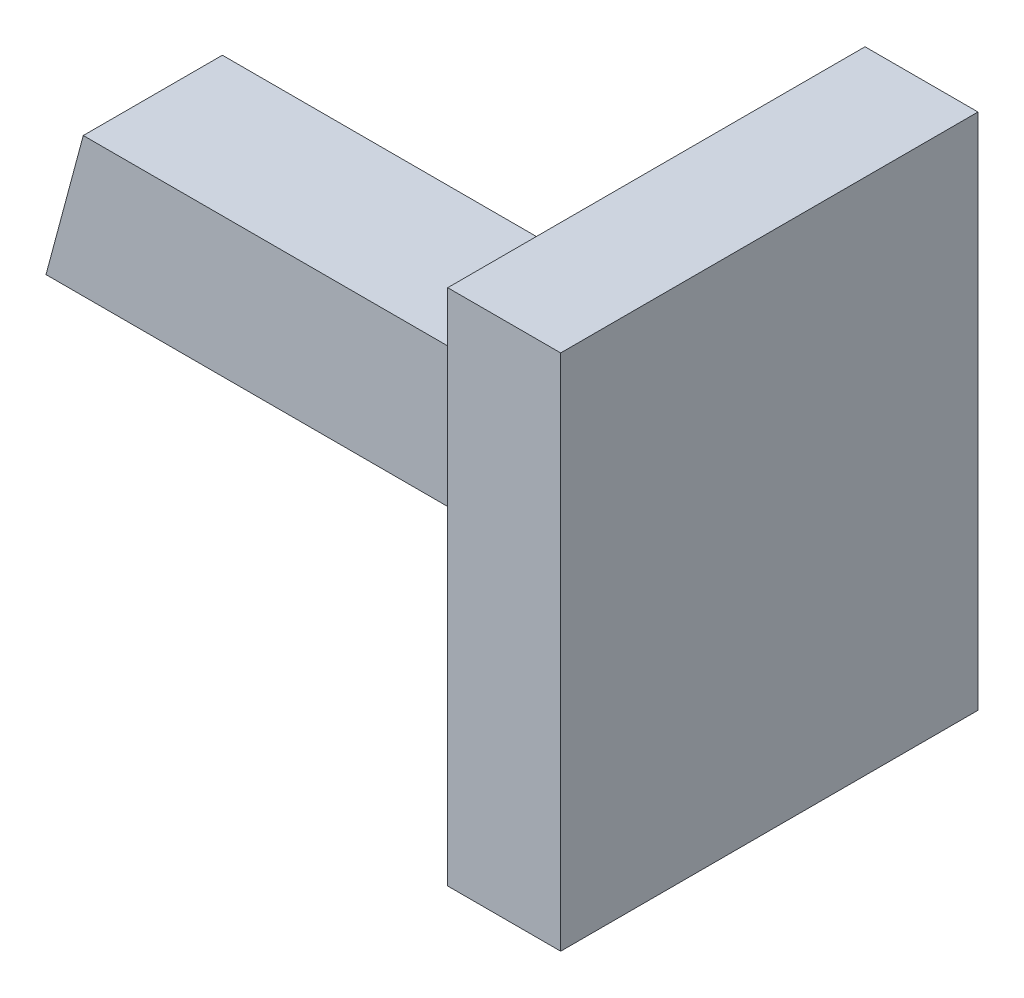
ISO-10303-21;
HEADER;
FILE_DESCRIPTION(('STEP AP214'),'2;1');
FILE_NAME('part.step','',(''),(''),'','','');
FILE_SCHEMA(('AUTOMOTIVE_DESIGN { 1 0 10303 214 1 1 1 1 }'));
ENDSEC;
DATA;
#1=APPLICATION_CONTEXT('core data for automotive mechanical design processes');
#2=APPLICATION_PROTOCOL_DEFINITION('international standard','automotive_design',2000,#1);
#3=PRODUCT_CONTEXT('',#1,'mechanical');
#4=PRODUCT('Part','Part','',(#3));
#5=PRODUCT_RELATED_PRODUCT_CATEGORY('part','',(#4));
#6=PRODUCT_DEFINITION_FORMATION('','',#4);
#7=PRODUCT_DEFINITION_CONTEXT('part definition',#1,'design');
#8=PRODUCT_DEFINITION('design','',#6,#7);
#9=PRODUCT_DEFINITION_SHAPE('','',#8);
#10=(LENGTH_UNIT() NAMED_UNIT(*) SI_UNIT(.MILLI.,.METRE.));
#11=(NAMED_UNIT(*) PLANE_ANGLE_UNIT() SI_UNIT($,.RADIAN.));
#12=(NAMED_UNIT(*) SI_UNIT($,.STERADIAN.) SOLID_ANGLE_UNIT());
#13=UNCERTAINTY_MEASURE_WITH_UNIT(LENGTH_MEASURE(1.E-05),#10,'distance_accuracy_value','');
#14=(GEOMETRIC_REPRESENTATION_CONTEXT(3) GLOBAL_UNCERTAINTY_ASSIGNED_CONTEXT((#13)) GLOBAL_UNIT_ASSIGNED_CONTEXT((#10,
#11,#12)) REPRESENTATION_CONTEXT('',''));
#15=CARTESIAN_POINT('',(0.,0.,0.));
#16=DIRECTION('',(0.,0.,1.));
#17=DIRECTION('',(1.,0.,0.));
#18=AXIS2_PLACEMENT_3D('',#15,#16,#17);
#19=CARTESIAN_POINT('',(0.,0.,10.));
#20=DIRECTION('',(0.,1.,0.));
#21=DIRECTION('',(0.,0.,1.));
#22=AXIS2_PLACEMENT_3D('',#19,#20,#21);
#23=PLANE('',#22);
#24=DIRECTION('',(1.,0.,0.));
#25=VECTOR('',#24,1.);
#26=CARTESIAN_POINT('',(0.,0.,0.));
#27=LINE('',#26,#25);
#28=CARTESIAN_POINT('',(0.,0.,0.));
#29=VERTEX_POINT('',#28);
#30=CARTESIAN_POINT('',(38.8790967226219,0.,0.));
#31=VERTEX_POINT('',#30);
#32=EDGE_CURVE('E133',#29,#31,#27,.T.);
#33=ORIENTED_EDGE('',*,*,#32,.T.);
#34=DIRECTION('',(0.,0.,1.));
#35=VECTOR('',#34,1.);
#36=CARTESIAN_POINT('',(38.8790967226219,0.,10.));
#37=LINE('',#36,#35);
#38=CARTESIAN_POINT('',(38.8790967226219,0.,10.));
#39=VERTEX_POINT('',#38);
#40=EDGE_CURVE('E125',#31,#39,#37,.T.);
#41=ORIENTED_EDGE('',*,*,#40,.T.);
#42=DIRECTION('',(1.,0.,0.));
#43=VECTOR('',#42,1.);
#44=CARTESIAN_POINT('',(0.,0.,10.));
#45=LINE('',#44,#43);
#46=CARTESIAN_POINT('',(0.,0.,10.));
#47=VERTEX_POINT('',#46);
#48=EDGE_CURVE('E121',#47,#39,#45,.T.);
#49=ORIENTED_EDGE('',*,*,#48,.F.);
#50=DIRECTION('',(0.,0.,-1.));
#51=VECTOR('',#50,1.);
#52=CARTESIAN_POINT('',(0.,0.,10.));
#53=LINE('',#52,#51);
#54=EDGE_CURVE('E109',#47,#29,#53,.T.);
#55=ORIENTED_EDGE('',*,*,#54,.T.);
#56=EDGE_LOOP('',(#33,#41,#49,#55));
#57=FACE_BOUND('',#56,.T.);
#58=ADVANCED_FACE('F45',(#57),#23,.F.);
#59=CARTESIAN_POINT('',(0.,10.,10.));
#60=DIRECTION('',(0.,-1.,0.));
#61=DIRECTION('',(0.,0.,-1.));
#62=AXIS2_PLACEMENT_3D('',#59,#60,#61);
#63=PLANE('',#62);
#64=DIRECTION('',(-1.,0.,0.));
#65=VECTOR('',#64,1.);
#66=CARTESIAN_POINT('',(0.,10.,0.));
#67=LINE('',#66,#65);
#68=CARTESIAN_POINT('',(38.8790967226219,10.,0.));
#69=VERTEX_POINT('',#68);
#70=CARTESIAN_POINT('',(2.67949192431127,10.,0.));
#71=VERTEX_POINT('',#70);
#72=EDGE_CURVE('E127',#69,#71,#67,.T.);
#73=ORIENTED_EDGE('',*,*,#72,.T.);
#74=DIRECTION('',(0.,0.,1.));
#75=VECTOR('',#74,1.);
#76=CARTESIAN_POINT('',(2.67949192431127,10.,-10.));
#77=LINE('',#76,#75);
#78=CARTESIAN_POINT('',(2.67949192431127,10.,10.));
#79=VERTEX_POINT('',#78);
#80=EDGE_CURVE('E59',#71,#79,#77,.T.);
#81=ORIENTED_EDGE('',*,*,#80,.T.);
#82=DIRECTION('',(-1.,0.,0.));
#83=VECTOR('',#82,1.);
#84=CARTESIAN_POINT('',(0.,10.,10.));
#85=LINE('',#84,#83);
#86=CARTESIAN_POINT('',(38.8790967226219,10.,10.));
#87=VERTEX_POINT('',#86);
#88=EDGE_CURVE('E118',#87,#79,#85,.T.);
#89=ORIENTED_EDGE('',*,*,#88,.F.);
#90=DIRECTION('',(0.,0.,-1.));
#91=VECTOR('',#90,1.);
#92=CARTESIAN_POINT('',(38.8790967226219,10.,10.));
#93=LINE('',#92,#91);
#94=EDGE_CURVE('E145',#87,#69,#93,.T.);
#95=ORIENTED_EDGE('',*,*,#94,.T.);
#96=EDGE_LOOP('',(#73,#81,#89,#95));
#97=FACE_BOUND('',#96,.T.);
#98=ADVANCED_FACE('F149',(#97),#63,.F.);
#99=CARTESIAN_POINT('',(0.,0.,10.));
#100=DIRECTION('',(0.,0.,-1.));
#101=DIRECTION('',(-1.,0.,0.));
#102=AXIS2_PLACEMENT_3D('',#99,#100,#101);
#103=PLANE('',#102);
#104=ORIENTED_EDGE('',*,*,#88,.T.);
#105=DIRECTION('',(0.258819045102525,0.965925826289067,0.));
#106=VECTOR('',#105,1.);
#107=CARTESIAN_POINT('',(2.67949192431127,10.,10.));
#108=LINE('',#107,#106);
#109=EDGE_CURVE('E112',#47,#79,#108,.T.);
#110=ORIENTED_EDGE('',*,*,#109,.F.);
#111=ORIENTED_EDGE('',*,*,#48,.T.);
#112=DIRECTION('',(0.,1.,0.));
#113=VECTOR('',#112,1.);
#114=CARTESIAN_POINT('',(38.8790967226219,0.,10.));
#115=LINE('',#114,#113);
#116=EDGE_CURVE('E67',#39,#87,#115,.T.);
#117=ORIENTED_EDGE('',*,*,#116,.T.);
#118=EDGE_LOOP('',(#104,#110,#111,#117));
#119=FACE_BOUND('',#118,.T.);
#120=ADVANCED_FACE('F120',(#119),#103,.F.);
#121=CARTESIAN_POINT('',(0.,0.,0.));
#122=DIRECTION('',(0.,0.,-1.));
#123=DIRECTION('',(-1.,0.,0.));
#124=AXIS2_PLACEMENT_3D('',#121,#122,#123);
#125=PLANE('',#124);
#126=DIRECTION('',(-0.258819045102525,-0.965925826289067,0.));
#127=VECTOR('',#126,1.);
#128=CARTESIAN_POINT('',(0.,0.,0.));
#129=LINE('',#128,#127);
#130=EDGE_CURVE('E11',#71,#29,#129,.T.);
#131=ORIENTED_EDGE('',*,*,#130,.F.);
#132=ORIENTED_EDGE('',*,*,#72,.F.);
#133=DIRECTION('',(0.,1.,0.));
#134=VECTOR('',#133,1.);
#135=CARTESIAN_POINT('',(38.8790967226219,0.,0.));
#136=LINE('',#135,#134);
#137=EDGE_CURVE('E53',#31,#69,#136,.T.);
#138=ORIENTED_EDGE('',*,*,#137,.F.);
#139=ORIENTED_EDGE('',*,*,#32,.F.);
#140=EDGE_LOOP('',(#131,#132,#138,#139));
#141=FACE_BOUND('',#140,.T.);
#142=ADVANCED_FACE('F147',(#141),#125,.T.);
#143=CARTESIAN_POINT('',(38.8790967226219,-13.625,-10.));
#144=DIRECTION('',(-1.,0.,0.));
#145=DIRECTION('',(0.,-1.,0.));
#146=AXIS2_PLACEMENT_3D('',#143,#144,#145);
#147=PLANE('',#146);
#148=DIRECTION('',(0.,0.,1.));
#149=VECTOR('',#148,1.);
#150=CARTESIAN_POINT('',(38.8790967226219,-13.625,-10.));
#151=LINE('',#150,#149);
#152=CARTESIAN_POINT('',(38.8790967226219,-13.625,-10.));
#153=VERTEX_POINT('',#152);
#154=CARTESIAN_POINT('',(38.8790967226219,-13.625,20.));
#155=VERTEX_POINT('',#154);
#156=EDGE_CURVE('E155',#153,#155,#151,.T.);
#157=ORIENTED_EDGE('',*,*,#156,.T.);
#158=DIRECTION('',(0.,-1.,0.));
#159=VECTOR('',#158,1.);
#160=CARTESIAN_POINT('',(38.8790967226219,-13.625,20.));
#161=LINE('',#160,#159);
#162=CARTESIAN_POINT('',(38.8790967226219,23.625,20.));
#163=VERTEX_POINT('',#162);
#164=EDGE_CURVE('E186',#163,#155,#161,.T.);
#165=ORIENTED_EDGE('',*,*,#164,.F.);
#166=DIRECTION('',(0.,0.,1.));
#167=VECTOR('',#166,1.);
#168=CARTESIAN_POINT('',(38.8790967226219,23.625,-10.));
#169=LINE('',#168,#167);
#170=CARTESIAN_POINT('',(38.8790967226219,23.625,-10.));
#171=VERTEX_POINT('',#170);
#172=EDGE_CURVE('E161',#171,#163,#169,.T.);
#173=ORIENTED_EDGE('',*,*,#172,.F.);
#174=DIRECTION('',(0.,-1.,0.));
#175=VECTOR('',#174,1.);
#176=CARTESIAN_POINT('',(38.8790967226219,-13.625,-10.));
#177=LINE('',#176,#175);
#178=EDGE_CURVE('E170',#171,#153,#177,.T.);
#179=ORIENTED_EDGE('',*,*,#178,.T.);
#180=EDGE_LOOP('',(#157,#165,#173,#179));
#181=FACE_BOUND('',#180,.T.);
#182=ORIENTED_EDGE('',*,*,#116,.F.);
#183=ORIENTED_EDGE('',*,*,#40,.F.);
#184=ORIENTED_EDGE('',*,*,#137,.T.);
#185=ORIENTED_EDGE('',*,*,#94,.F.);
#186=EDGE_LOOP('',(#182,#183,#184,#185));
#187=FACE_BOUND('',#186,.T.);
#188=ADVANCED_FACE('F143',(#181,#187),#147,.T.);
#189=CARTESIAN_POINT('',(47.,-13.625,-10.));
#190=DIRECTION('',(0.,-1.,0.));
#191=DIRECTION('',(0.,0.,-1.));
#192=AXIS2_PLACEMENT_3D('',#189,#190,#191);
#193=PLANE('',#192);
#194=DIRECTION('',(0.,0.,1.));
#195=VECTOR('',#194,1.);
#196=CARTESIAN_POINT('',(47.,-13.625,-10.));
#197=LINE('',#196,#195);
#198=CARTESIAN_POINT('',(47.,-13.625,-10.));
#199=VERTEX_POINT('',#198);
#200=CARTESIAN_POINT('',(47.,-13.625,20.));
#201=VERTEX_POINT('',#200);
#202=EDGE_CURVE('E151',#199,#201,#197,.T.);
#203=ORIENTED_EDGE('',*,*,#202,.T.);
#204=DIRECTION('',(1.,0.,0.));
#205=VECTOR('',#204,1.);
#206=CARTESIAN_POINT('',(47.,-13.625,20.));
#207=LINE('',#206,#205);
#208=EDGE_CURVE('E182',#155,#201,#207,.T.);
#209=ORIENTED_EDGE('',*,*,#208,.F.);
#210=ORIENTED_EDGE('',*,*,#156,.F.);
#211=DIRECTION('',(1.,0.,0.));
#212=VECTOR('',#211,1.);
#213=CARTESIAN_POINT('',(47.,-13.625,-10.));
#214=LINE('',#213,#212);
#215=EDGE_CURVE('E162',#153,#199,#214,.T.);
#216=ORIENTED_EDGE('',*,*,#215,.T.);
#217=EDGE_LOOP('',(#203,#209,#210,#216));
#218=FACE_BOUND('',#217,.T.);
#219=ADVANCED_FACE('F217',(#218),#193,.T.);
#220=CARTESIAN_POINT('',(47.,23.625,-10.));
#221=DIRECTION('',(0.,1.,0.));
#222=DIRECTION('',(0.,0.,1.));
#223=AXIS2_PLACEMENT_3D('',#220,#221,#222);
#224=PLANE('',#223);
#225=ORIENTED_EDGE('',*,*,#172,.T.);
#226=DIRECTION('',(-1.,0.,0.));
#227=VECTOR('',#226,1.);
#228=CARTESIAN_POINT('',(47.,23.625,20.));
#229=LINE('',#228,#227);
#230=CARTESIAN_POINT('',(47.,23.625,20.));
#231=VERTEX_POINT('',#230);
#232=EDGE_CURVE('E190',#231,#163,#229,.T.);
#233=ORIENTED_EDGE('',*,*,#232,.F.);
#234=DIRECTION('',(0.,0.,1.));
#235=VECTOR('',#234,1.);
#236=CARTESIAN_POINT('',(47.,23.625,-10.));
#237=LINE('',#236,#235);
#238=CARTESIAN_POINT('',(47.,23.625,-10.));
#239=VERTEX_POINT('',#238);
#240=EDGE_CURVE('E158',#239,#231,#237,.T.);
#241=ORIENTED_EDGE('',*,*,#240,.F.);
#242=DIRECTION('',(-1.,0.,0.));
#243=VECTOR('',#242,1.);
#244=CARTESIAN_POINT('',(47.,23.625,-10.));
#245=LINE('',#244,#243);
#246=EDGE_CURVE('E174',#239,#171,#245,.T.);
#247=ORIENTED_EDGE('',*,*,#246,.T.);
#248=EDGE_LOOP('',(#225,#233,#241,#247));
#249=FACE_BOUND('',#248,.T.);
#250=ADVANCED_FACE('F210',(#249),#224,.T.);
#251=CARTESIAN_POINT('',(0.,0.,-10.));
#252=DIRECTION('',(0.,0.,1.));
#253=DIRECTION('',(1.,0.,0.));
#254=AXIS2_PLACEMENT_3D('',#251,#252,#253);
#255=PLANE('',#254);
#256=DIRECTION('',(0.,1.,0.));
#257=VECTOR('',#256,1.);
#258=CARTESIAN_POINT('',(47.,-13.625,-10.));
#259=LINE('',#258,#257);
#260=EDGE_CURVE('E178',#199,#239,#259,.T.);
#261=ORIENTED_EDGE('',*,*,#260,.F.);
#262=ORIENTED_EDGE('',*,*,#215,.F.);
#263=ORIENTED_EDGE('',*,*,#178,.F.);
#264=ORIENTED_EDGE('',*,*,#246,.F.);
#265=EDGE_LOOP('',(#261,#262,#263,#264));
#266=FACE_BOUND('',#265,.T.);
#267=ADVANCED_FACE('F215',(#266),#255,.F.);
#268=CARTESIAN_POINT('',(0.,0.,20.));
#269=DIRECTION('',(0.,0.,1.));
#270=DIRECTION('',(1.,0.,0.));
#271=AXIS2_PLACEMENT_3D('',#268,#269,#270);
#272=PLANE('',#271);
#273=DIRECTION('',(0.,1.,0.));
#274=VECTOR('',#273,1.);
#275=CARTESIAN_POINT('',(47.,-13.625,20.));
#276=LINE('',#275,#274);
#277=EDGE_CURVE('E194',#201,#231,#276,.T.);
#278=ORIENTED_EDGE('',*,*,#277,.T.);
#279=ORIENTED_EDGE('',*,*,#232,.T.);
#280=ORIENTED_EDGE('',*,*,#164,.T.);
#281=ORIENTED_EDGE('',*,*,#208,.T.);
#282=EDGE_LOOP('',(#278,#279,#280,#281));
#283=FACE_BOUND('',#282,.T.);
#284=ADVANCED_FACE('F201',(#283),#272,.T.);
#285=CARTESIAN_POINT('',(47.,0.,10.));
#286=DIRECTION('',(-1.,0.,0.));
#287=DIRECTION('',(0.,0.,1.));
#288=AXIS2_PLACEMENT_3D('',#285,#286,#287);
#289=PLANE('',#288);
#290=ORIENTED_EDGE('',*,*,#240,.T.);
#291=ORIENTED_EDGE('',*,*,#277,.F.);
#292=ORIENTED_EDGE('',*,*,#202,.F.);
#293=ORIENTED_EDGE('',*,*,#260,.T.);
#294=EDGE_LOOP('',(#290,#291,#292,#293));
#295=FACE_BOUND('',#294,.T.);
#296=ADVANCED_FACE('F206',(#295),#289,.F.);
#297=CARTESIAN_POINT('',(2.67949192431127,10.,-10.));
#298=DIRECTION('',(0.965925826289067,-0.258819045102525,0.));
#299=DIRECTION('',(0.258819045102525,0.965925826289067,0.));
#300=AXIS2_PLACEMENT_3D('',#297,#298,#299);
#301=PLANE('',#300);
#302=ORIENTED_EDGE('',*,*,#130,.T.);
#303=ORIENTED_EDGE('',*,*,#54,.F.);
#304=ORIENTED_EDGE('',*,*,#109,.T.);
#305=ORIENTED_EDGE('',*,*,#80,.F.);
#306=EDGE_LOOP('',(#302,#303,#304,#305));
#307=FACE_BOUND('',#306,.T.);
#308=ADVANCED_FACE('F111',(#307),#301,.F.);
#309=CLOSED_SHELL('',(#58,#98,#120,#142,#188,#219,#250,#267,#284,#296,#308));
#310=MANIFOLD_SOLID_BREP('B2',#309);
#311=ADVANCED_BREP_SHAPE_REPRESENTATION('',(#18,#310),#14);
#312=SHAPE_DEFINITION_REPRESENTATION(#9,#311);
ENDSEC;
END-ISO-10303-21;
